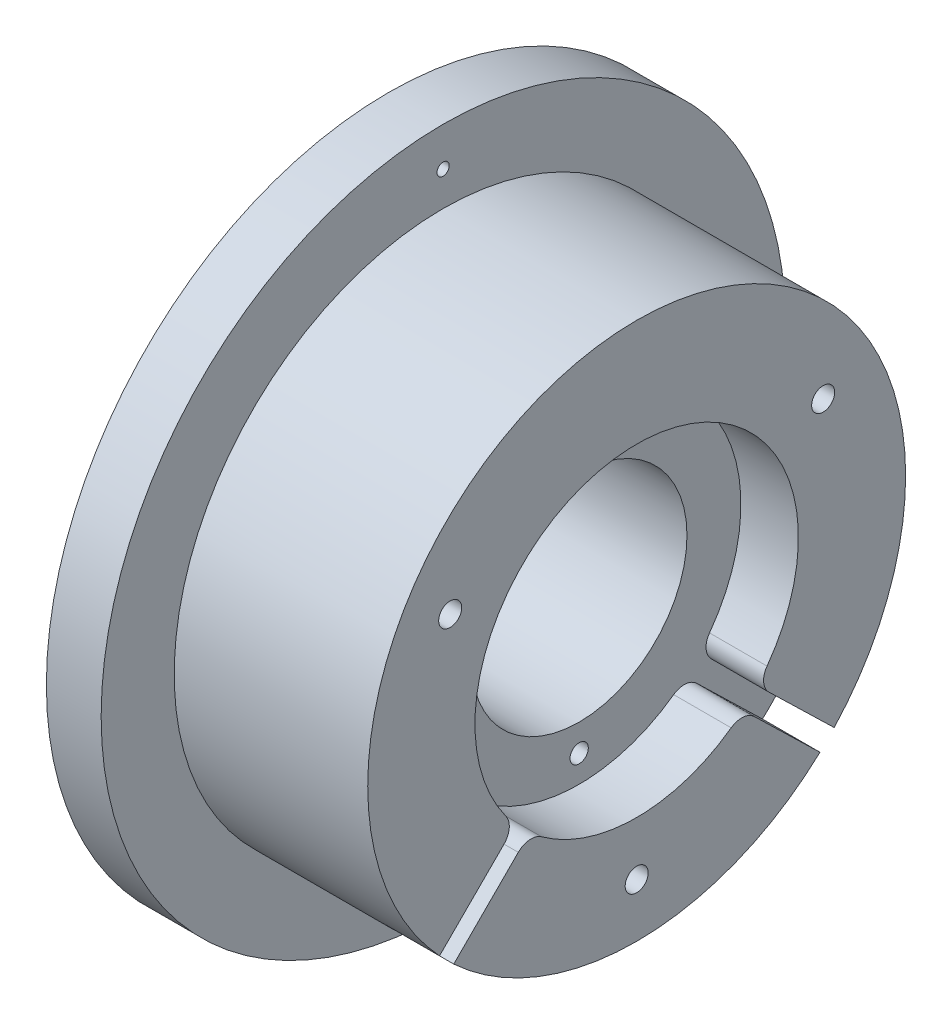
ISO-10303-21;
HEADER;
FILE_DESCRIPTION(('STEP AP214'),'2;1');
FILE_NAME('part.step','',(''),(''),'','','');
FILE_SCHEMA(('AUTOMOTIVE_DESIGN { 1 0 10303 214 1 1 1 1 }'));
ENDSEC;
DATA;
#1=APPLICATION_CONTEXT('core data for automotive mechanical design processes');
#2=APPLICATION_PROTOCOL_DEFINITION('international standard','automotive_design',2000,#1);
#3=PRODUCT_CONTEXT('',#1,'mechanical');
#4=PRODUCT('Part','Part','',(#3));
#5=PRODUCT_RELATED_PRODUCT_CATEGORY('part','',(#4));
#6=PRODUCT_DEFINITION_FORMATION('','',#4);
#7=PRODUCT_DEFINITION_CONTEXT('part definition',#1,'design');
#8=PRODUCT_DEFINITION('design','',#6,#7);
#9=PRODUCT_DEFINITION_SHAPE('','',#8);
#10=(LENGTH_UNIT() NAMED_UNIT(*) SI_UNIT(.MILLI.,.METRE.));
#11=(NAMED_UNIT(*) PLANE_ANGLE_UNIT() SI_UNIT($,.RADIAN.));
#12=(NAMED_UNIT(*) SI_UNIT($,.STERADIAN.) SOLID_ANGLE_UNIT());
#13=UNCERTAINTY_MEASURE_WITH_UNIT(LENGTH_MEASURE(1.E-05),#10,'distance_accuracy_value','');
#14=(GEOMETRIC_REPRESENTATION_CONTEXT(3) GLOBAL_UNCERTAINTY_ASSIGNED_CONTEXT((#13)) GLOBAL_UNIT_ASSIGNED_CONTEXT((#10,
#11,#12)) REPRESENTATION_CONTEXT('',''));
#15=CARTESIAN_POINT('',(0.,0.,0.));
#16=DIRECTION('',(0.,0.,1.));
#17=DIRECTION('',(1.,0.,0.));
#18=AXIS2_PLACEMENT_3D('',#15,#16,#17);
#19=CARTESIAN_POINT('',(17.272,0.,0.));
#20=DIRECTION('',(-1.,0.,0.));
#21=DIRECTION('',(0.,-1.,0.));
#22=AXIS2_PLACEMENT_3D('',#19,#20,#21);
#23=PLANE('',#22);
#24=CARTESIAN_POINT('',(17.272,7.48875,12.9708954851814));
#25=DIRECTION('',(1.,0.,0.));
#26=DIRECTION('',(0.,0.,-1.));
#27=AXIS2_PLACEMENT_3D('',#24,#25,#26);
#28=CIRCLE('',#27,0.79999999999999);
#29=CARTESIAN_POINT('',(17.272,7.48875,12.1708954851814));
#30=VERTEX_POINT('',#29);
#31=EDGE_CURVE('E183',#30,#30,#28,.T.);
#32=ORIENTED_EDGE('',*,*,#31,.F.);
#33=EDGE_LOOP('',(#32));
#34=FACE_BOUND('',#33,.T.);
#35=DIRECTION('',(0.,0.707106781186554,-0.707106781186541));
#36=VECTOR('',#35,1.);
#37=CARTESIAN_POINT('',(17.272,0.494974746830583,0.494974746830592));
#38=LINE('',#37,#36);
#39=CARTESIAN_POINT('',(17.272,-12.7236785584424,13.7136280521033));
#40=VERTEX_POINT('',#39);
#41=CARTESIAN_POINT('',(17.272,-8.2356466514435,9.22559614510452));
#42=VERTEX_POINT('',#41);
#43=EDGE_CURVE('E240',#40,#42,#38,.T.);
#44=ORIENTED_EDGE('',*,*,#43,.T.);
#45=CARTESIAN_POINT('',(17.272,-7.35176317496033,10.1094796215877));
#46=DIRECTION('',(-1.,0.,0.));
#47=DIRECTION('',(0.,-1.,0.));
#48=AXIS2_PLACEMENT_3D('',#45,#46,#47);
#49=CIRCLE('',#48,1.25);
#50=CARTESIAN_POINT('',(17.272,-6.6165868574643,9.09853165942894));
#51=VERTEX_POINT('',#50);
#52=EDGE_CURVE('E285',#42,#51,#49,.F.);
#53=ORIENTED_EDGE('',*,*,#52,.T.);
#54=CARTESIAN_POINT('',(17.272,0.,0.));
#55=DIRECTION('',(1.,0.,0.));
#56=DIRECTION('',(0.,1.,0.));
#57=AXIS2_PLACEMENT_3D('',#54,#55,#56);
#58=CIRCLE('',#57,11.25);
#59=CARTESIAN_POINT('',(17.272,-6.65957270857316,-9.06711593282161));
#60=VERTEX_POINT('',#59);
#61=EDGE_CURVE('E270',#60,#51,#58,.T.);
#62=ORIENTED_EDGE('',*,*,#61,.F.);
#63=CARTESIAN_POINT('',(17.272,-7.39952523174796,-10.0745732586907));
#64=DIRECTION('',(-1.,0.,0.));
#65=DIRECTION('',(0.,-1.,0.));
#66=AXIS2_PLACEMENT_3D('',#63,#64,#65);
#67=CIRCLE('',#66,1.25);
#68=CARTESIAN_POINT('',(17.272,-8.29660927780091,-9.20409051083334));
#69=VERTEX_POINT('',#68);
#70=EDGE_CURVE('E283',#60,#69,#67,.F.);
#71=ORIENTED_EDGE('',*,*,#70,.T.);
#72=DIRECTION('',(0.,-0.696386198285868,-0.717667236842365));
#73=VECTOR('',#72,1.);
#74=CARTESIAN_POINT('',(17.272,0.326823466436906,-0.317132146514021));
#75=LINE('',#74,#73);
#76=CARTESIAN_POINT('',(17.272,-12.6966821527148,-13.7386263040718));
#77=VERTEX_POINT('',#76);
#78=EDGE_CURVE('E218',#69,#77,#75,.T.);
#79=ORIENTED_EDGE('',*,*,#78,.T.);
#80=CARTESIAN_POINT('',(17.272,0.,0.));
#81=DIRECTION('',(1.,0.,0.));
#82=DIRECTION('',(0.,1.,0.));
#83=AXIS2_PLACEMENT_3D('',#80,#81,#82);
#84=CIRCLE('',#83,18.7071);
#85=EDGE_CURVE('E266',#77,#40,#84,.T.);
#86=ORIENTED_EDGE('',*,*,#85,.T.);
#87=EDGE_LOOP('',(#44,#53,#62,#71,#79,#86));
#88=FACE_BOUND('',#87,.T.);
#89=CARTESIAN_POINT('',(17.272,7.48875000000001,-12.9708954851814));
#90=DIRECTION('',(1.,0.,0.));
#91=DIRECTION('',(0.,0.,-1.));
#92=AXIS2_PLACEMENT_3D('',#89,#90,#91);
#93=CIRCLE('',#92,0.79999999999999);
#94=CARTESIAN_POINT('',(17.272,7.48875000000001,-13.7708954851814));
#95=VERTEX_POINT('',#94);
#96=EDGE_CURVE('E182',#95,#95,#93,.T.);
#97=ORIENTED_EDGE('',*,*,#96,.F.);
#98=EDGE_LOOP('',(#97));
#99=FACE_BOUND('',#98,.T.);
#100=ADVANCED_FACE('F77',(#34,#88,#99),#23,.F.);
#101=CARTESIAN_POINT('',(13.272,0.,0.));
#102=DIRECTION('',(1.,0.,0.));
#103=DIRECTION('',(0.,1.,0.));
#104=AXIS2_PLACEMENT_3D('',#101,#102,#103);
#105=CYLINDRICAL_SURFACE('',#104,11.25);
#106=ORIENTED_EDGE('',*,*,#61,.T.);
#107=DIRECTION('',(1.,0.,0.));
#108=VECTOR('',#107,1.);
#109=CARTESIAN_POINT('',(13.272,-6.61658685746429,9.09853165942894));
#110=LINE('',#109,#108);
#111=CARTESIAN_POINT('',(13.272,-6.61658685746429,9.09853165942894));
#112=VERTEX_POINT('',#111);
#113=EDGE_CURVE('E289',#51,#112,#110,.F.);
#114=ORIENTED_EDGE('',*,*,#113,.T.);
#115=CARTESIAN_POINT('',(13.272,0.,0.));
#116=DIRECTION('',(1.,0.,0.));
#117=DIRECTION('',(0.,1.,0.));
#118=AXIS2_PLACEMENT_3D('',#115,#116,#117);
#119=CIRCLE('',#118,11.25);
#120=CARTESIAN_POINT('',(13.272,-6.65957270857316,-9.06711593282161));
#121=VERTEX_POINT('',#120);
#122=EDGE_CURVE('E274',#121,#112,#119,.T.);
#123=ORIENTED_EDGE('',*,*,#122,.F.);
#124=DIRECTION('',(1.,0.,0.));
#125=VECTOR('',#124,1.);
#126=CARTESIAN_POINT('',(13.272,-6.65957270857316,-9.06711593282161));
#127=LINE('',#126,#125);
#128=EDGE_CURVE('E287',#121,#60,#127,.T.);
#129=ORIENTED_EDGE('',*,*,#128,.T.);
#130=EDGE_LOOP('',(#106,#114,#123,#129));
#131=FACE_BOUND('',#130,.T.);
#132=ADVANCED_FACE('F349',(#131),#105,.F.);
#133=CARTESIAN_POINT('',(13.272,-9.09853165942906,6.61658685746414));
#134=VERTEX_POINT('',#133);
#135=CARTESIAN_POINT('',(13.272,-9.13015115297179,-6.57288672684141));
#136=VERTEX_POINT('',#135);
#137=EDGE_CURVE('E275',#134,#136,#119,.T.);
#138=ORIENTED_EDGE('',*,*,#137,.F.);
#139=DIRECTION('',(1.,0.,0.));
#140=VECTOR('',#139,1.);
#141=CARTESIAN_POINT('',(13.272,-9.09853165942906,6.61658685746414));
#142=LINE('',#141,#140);
#143=CARTESIAN_POINT('',(17.272,-9.09853165942906,6.61658685746414));
#144=VERTEX_POINT('',#143);
#145=EDGE_CURVE('E296',#134,#144,#142,.T.);
#146=ORIENTED_EDGE('',*,*,#145,.T.);
#147=CARTESIAN_POINT('',(17.272,-9.13015115297179,-6.57288672684141));
#148=VERTEX_POINT('',#147);
#149=EDGE_CURVE('E271',#144,#148,#58,.T.);
#150=ORIENTED_EDGE('',*,*,#149,.T.);
#151=DIRECTION('',(1.,0.,0.));
#152=VECTOR('',#151,1.);
#153=CARTESIAN_POINT('',(13.272,-9.13015115297179,-6.57288672684141));
#154=LINE('',#153,#152);
#155=EDGE_CURVE('E294',#148,#136,#154,.F.);
#156=ORIENTED_EDGE('',*,*,#155,.T.);
#157=EDGE_LOOP('',(#138,#146,#150,#156));
#158=FACE_BOUND('',#157,.T.);
#159=ADVANCED_FACE('F317',(#158),#105,.F.);
#160=CARTESIAN_POINT('',(17.272,-14.9775,0.));
#161=DIRECTION('',(1.,0.,0.));
#162=DIRECTION('',(0.,0.,-1.));
#163=AXIS2_PLACEMENT_3D('',#160,#161,#162);
#164=CIRCLE('',#163,0.79999999999999);
#165=CARTESIAN_POINT('',(17.272,-14.9775,-0.799999999999992));
#166=VERTEX_POINT('',#165);
#167=EDGE_CURVE('E193',#166,#166,#164,.T.);
#168=ORIENTED_EDGE('',*,*,#167,.F.);
#169=EDGE_LOOP('',(#168));
#170=FACE_BOUND('',#169,.T.);
#171=ORIENTED_EDGE('',*,*,#149,.F.);
#172=CARTESIAN_POINT('',(17.272,-10.1094796215878,7.35176317496015));
#173=DIRECTION('',(-1.,0.,0.));
#174=DIRECTION('',(0.,-1.,0.));
#175=AXIS2_PLACEMENT_3D('',#172,#173,#174);
#176=CIRCLE('',#175,1.25);
#177=CARTESIAN_POINT('',(17.272,-9.22559614510466,8.23564665144334));
#178=VERTEX_POINT('',#177);
#179=EDGE_CURVE('E300',#144,#178,#176,.F.);
#180=ORIENTED_EDGE('',*,*,#179,.T.);
#181=DIRECTION('',(0.,-0.707106781186553,0.707106781186542));
#182=VECTOR('',#181,1.);
#183=CARTESIAN_POINT('',(17.272,-0.494974746830585,-0.494974746830593));
#184=LINE('',#183,#182);
#185=CARTESIAN_POINT('',(17.272,-13.7136280521035,12.7236785584421));
#186=VERTEX_POINT('',#185);
#187=EDGE_CURVE('E236',#178,#186,#184,.T.);
#188=ORIENTED_EDGE('',*,*,#187,.T.);
#189=CARTESIAN_POINT('',(17.272,-13.6886585047887,-12.7505379788179));
#190=VERTEX_POINT('',#189);
#191=EDGE_CURVE('E267',#186,#190,#84,.T.);
#192=ORIENTED_EDGE('',*,*,#191,.T.);
#193=DIRECTION('',(0.,0.696386198285868,0.717667236842366));
#194=VECTOR('',#193,1.);
#195=CARTESIAN_POINT('',(17.272,-0.677910665142419,0.657808531086206));
#196=LINE('',#195,#194);
#197=CARTESIAN_POINT('',(17.272,-9.24752834613792,-8.17369022212556));
#198=VERTEX_POINT('',#197);
#199=EDGE_CURVE('E222',#190,#198,#196,.T.);
#200=ORIENTED_EDGE('',*,*,#199,.T.);
#201=CARTESIAN_POINT('',(17.272,-10.1446123921909,-7.30320747426823));
#202=DIRECTION('',(-1.,0.,0.));
#203=DIRECTION('',(0.,-1.,0.));
#204=AXIS2_PLACEMENT_3D('',#201,#202,#203);
#205=CIRCLE('',#204,1.25);
#206=EDGE_CURVE('E298',#198,#148,#205,.F.);
#207=ORIENTED_EDGE('',*,*,#206,.T.);
#208=EDGE_LOOP('',(#171,#180,#188,#192,#200,#207));
#209=FACE_BOUND('',#208,.T.);
#210=ADVANCED_FACE('F324',(#170,#209),#23,.F.);
#211=CARTESIAN_POINT('',(13.272,0.,0.));
#212=DIRECTION('',(1.,0.,0.));
#213=DIRECTION('',(0.,1.,0.));
#214=AXIS2_PLACEMENT_3D('',#211,#212,#213);
#215=CYLINDRICAL_SURFACE('',#214,18.7071);
#216=CARTESIAN_POINT('',(3.81,0.,0.));
#217=DIRECTION('',(1.,0.,0.));
#218=DIRECTION('',(0.,1.,0.));
#219=AXIS2_PLACEMENT_3D('',#216,#217,#218);
#220=CIRCLE('',#219,18.7071);
#221=CARTESIAN_POINT('',(3.81,18.7071,0.));
#222=VERTEX_POINT('',#221);
#223=EDGE_CURVE('E263',#222,#222,#220,.T.);
#224=ORIENTED_EDGE('',*,*,#223,.T.);
#225=EDGE_LOOP('',(#224));
#226=FACE_BOUND('',#225,.T.);
#227=DIRECTION('',(1.,0.,0.));
#228=VECTOR('',#227,1.);
#229=CARTESIAN_POINT('',(-6.47510074540848,-12.6966821527148,-13.7386263040718));
#230=LINE('',#229,#228);
#231=CARTESIAN_POINT('',(13.272,-12.6966821527148,-13.7386263040718));
#232=VERTEX_POINT('',#231);
#233=EDGE_CURVE('E221',#232,#77,#230,.T.);
#234=ORIENTED_EDGE('',*,*,#233,.F.);
#235=CARTESIAN_POINT('',(13.272,0.,0.));
#236=DIRECTION('',(-1.,0.,0.));
#237=DIRECTION('',(0.,-1.,0.));
#238=AXIS2_PLACEMENT_3D('',#235,#236,#237);
#239=CIRCLE('',#238,18.7071);
#240=CARTESIAN_POINT('',(13.272,-13.6886585047887,-12.7505379788179));
#241=VERTEX_POINT('',#240);
#242=EDGE_CURVE('E226',#241,#232,#239,.F.);
#243=ORIENTED_EDGE('',*,*,#242,.F.);
#244=DIRECTION('',(1.,0.,0.));
#245=VECTOR('',#244,1.);
#246=CARTESIAN_POINT('',(-6.47510074540848,-13.6886585047887,-12.7505379788179));
#247=LINE('',#246,#245);
#248=EDGE_CURVE('E220',#241,#190,#247,.T.);
#249=ORIENTED_EDGE('',*,*,#248,.T.);
#250=ORIENTED_EDGE('',*,*,#191,.F.);
#251=DIRECTION('',(1.,0.,0.));
#252=VECTOR('',#251,1.);
#253=CARTESIAN_POINT('',(-6.47510074540848,-13.7136280521035,12.7236785584421));
#254=LINE('',#253,#252);
#255=CARTESIAN_POINT('',(13.272,-13.7136280521035,12.7236785584421));
#256=VERTEX_POINT('',#255);
#257=EDGE_CURVE('E239',#256,#186,#254,.T.);
#258=ORIENTED_EDGE('',*,*,#257,.F.);
#259=CARTESIAN_POINT('',(13.272,0.,0.));
#260=DIRECTION('',(-1.,0.,0.));
#261=DIRECTION('',(0.,-1.,0.));
#262=AXIS2_PLACEMENT_3D('',#259,#260,#261);
#263=CIRCLE('',#262,18.7071);
#264=CARTESIAN_POINT('',(13.272,-12.7236785584424,13.7136280521033));
#265=VERTEX_POINT('',#264);
#266=EDGE_CURVE('E243',#265,#256,#263,.F.);
#267=ORIENTED_EDGE('',*,*,#266,.F.);
#268=DIRECTION('',(1.,0.,0.));
#269=VECTOR('',#268,1.);
#270=CARTESIAN_POINT('',(-6.47510074540848,-12.7236785584424,13.7136280521033));
#271=LINE('',#270,#269);
#272=EDGE_CURVE('E244',#265,#40,#271,.T.);
#273=ORIENTED_EDGE('',*,*,#272,.T.);
#274=ORIENTED_EDGE('',*,*,#85,.F.);
#275=EDGE_LOOP('',(#234,#243,#249,#250,#258,#267,#273,#274));
#276=FACE_BOUND('',#275,.T.);
#277=ADVANCED_FACE('F332',(#226,#276),#215,.T.);
#278=CARTESIAN_POINT('',(13.272,0.,0.));
#279=DIRECTION('',(1.,0.,0.));
#280=DIRECTION('',(0.,1.,0.));
#281=AXIS2_PLACEMENT_3D('',#278,#279,#280);
#282=CYLINDRICAL_SURFACE('',#281,7.5);
#283=CARTESIAN_POINT('',(0.,0.,0.));
#284=DIRECTION('',(1.,0.,0.));
#285=DIRECTION('',(0.,1.,0.));
#286=AXIS2_PLACEMENT_3D('',#283,#284,#285);
#287=CIRCLE('',#286,7.5);
#288=CARTESIAN_POINT('',(0.,7.5,0.));
#289=VERTEX_POINT('',#288);
#290=EDGE_CURVE('E238',#289,#289,#287,.T.);
#291=ORIENTED_EDGE('',*,*,#290,.F.);
#292=EDGE_LOOP('',(#291));
#293=FACE_BOUND('',#292,.T.);
#294=CARTESIAN_POINT('',(13.272,0.,0.));
#295=DIRECTION('',(1.,0.,0.));
#296=DIRECTION('',(0.,1.,0.));
#297=AXIS2_PLACEMENT_3D('',#294,#295,#296);
#298=CIRCLE('',#297,7.5);
#299=CARTESIAN_POINT('',(13.272,7.5,0.));
#300=VERTEX_POINT('',#299);
#301=EDGE_CURVE('E277',#300,#300,#298,.T.);
#302=ORIENTED_EDGE('',*,*,#301,.T.);
#303=EDGE_LOOP('',(#302));
#304=FACE_BOUND('',#303,.T.);
#305=ADVANCED_FACE('F366',(#293,#304),#282,.F.);
#306=CARTESIAN_POINT('',(13.272,0.,0.));
#307=DIRECTION('',(-1.,0.,0.));
#308=DIRECTION('',(0.,-1.,0.));
#309=AXIS2_PLACEMENT_3D('',#306,#307,#308);
#310=PLANE('',#309);
#311=CARTESIAN_POINT('',(13.272,9.375,0.));
#312=DIRECTION('',(1.,0.,0.));
#313=DIRECTION('',(0.,1.,0.));
#314=AXIS2_PLACEMENT_3D('',#311,#312,#313);
#315=CIRCLE('',#314,0.635);
#316=CARTESIAN_POINT('',(13.272,10.01,0.));
#317=VERTEX_POINT('',#316);
#318=EDGE_CURVE('E204',#317,#317,#315,.T.);
#319=ORIENTED_EDGE('',*,*,#318,.F.);
#320=EDGE_LOOP('',(#319));
#321=FACE_BOUND('',#320,.T.);
#322=CARTESIAN_POINT('',(13.272,-9.375,0.));
#323=DIRECTION('',(1.,0.,0.));
#324=DIRECTION('',(0.,1.,0.));
#325=AXIS2_PLACEMENT_3D('',#322,#323,#324);
#326=CIRCLE('',#325,0.635);
#327=CARTESIAN_POINT('',(13.272,-8.74,0.));
#328=VERTEX_POINT('',#327);
#329=EDGE_CURVE('E199',#328,#328,#326,.T.);
#330=ORIENTED_EDGE('',*,*,#329,.F.);
#331=EDGE_LOOP('',(#330));
#332=FACE_BOUND('',#331,.T.);
#333=ORIENTED_EDGE('',*,*,#301,.F.);
#334=EDGE_LOOP('',(#333));
#335=FACE_BOUND('',#334,.T.);
#336=DIRECTION('',(0.,-0.707106781186553,0.707106781186542));
#337=VECTOR('',#336,1.);
#338=CARTESIAN_POINT('',(13.272,-0.494974746830585,-0.494974746830594));
#339=LINE('',#338,#337);
#340=CARTESIAN_POINT('',(13.272,-9.22559614510467,8.23564665144334));
#341=VERTEX_POINT('',#340);
#342=EDGE_CURVE('E225',#341,#256,#339,.T.);
#343=ORIENTED_EDGE('',*,*,#342,.F.);
#344=CARTESIAN_POINT('',(13.272,-10.1094796215878,7.35176317496015));
#345=DIRECTION('',(-1.,0.,0.));
#346=DIRECTION('',(0.,-1.,0.));
#347=AXIS2_PLACEMENT_3D('',#344,#345,#346);
#348=CIRCLE('',#347,1.25);
#349=EDGE_CURVE('E309',#341,#134,#348,.T.);
#350=ORIENTED_EDGE('',*,*,#349,.T.);
#351=ORIENTED_EDGE('',*,*,#137,.T.);
#352=CARTESIAN_POINT('',(13.272,-10.1446123921909,-7.30320747426823));
#353=DIRECTION('',(-1.,0.,0.));
#354=DIRECTION('',(0.,-1.,0.));
#355=AXIS2_PLACEMENT_3D('',#352,#353,#354);
#356=CIRCLE('',#355,1.25);
#357=CARTESIAN_POINT('',(13.272,-9.24752834613792,-8.17369022212556));
#358=VERTEX_POINT('',#357);
#359=EDGE_CURVE('E85',#136,#358,#356,.T.);
#360=ORIENTED_EDGE('',*,*,#359,.T.);
#361=DIRECTION('',(0.,0.696386198285868,0.717667236842366));
#362=VECTOR('',#361,1.);
#363=CARTESIAN_POINT('',(13.272,-0.677910665142419,0.657808531086206));
#364=LINE('',#363,#362);
#365=EDGE_CURVE('E215',#241,#358,#364,.T.);
#366=ORIENTED_EDGE('',*,*,#365,.F.);
#367=ORIENTED_EDGE('',*,*,#242,.T.);
#368=DIRECTION('',(0.,-0.696386198285868,-0.717667236842365));
#369=VECTOR('',#368,1.);
#370=CARTESIAN_POINT('',(13.272,0.326823466436906,-0.317132146514021));
#371=LINE('',#370,#369);
#372=CARTESIAN_POINT('',(13.272,-8.29660927780091,-9.20409051083334));
#373=VERTEX_POINT('',#372);
#374=EDGE_CURVE('E229',#373,#232,#371,.T.);
#375=ORIENTED_EDGE('',*,*,#374,.F.);
#376=CARTESIAN_POINT('',(13.272,-7.39952523174796,-10.0745732586907));
#377=DIRECTION('',(-1.,0.,0.));
#378=DIRECTION('',(0.,-1.,0.));
#379=AXIS2_PLACEMENT_3D('',#376,#377,#378);
#380=CIRCLE('',#379,1.25);
#381=EDGE_CURVE('E12',#373,#121,#380,.T.);
#382=ORIENTED_EDGE('',*,*,#381,.T.);
#383=ORIENTED_EDGE('',*,*,#122,.T.);
#384=CARTESIAN_POINT('',(13.272,-7.35176317496033,10.1094796215877));
#385=DIRECTION('',(-1.,0.,0.));
#386=DIRECTION('',(0.,-1.,0.));
#387=AXIS2_PLACEMENT_3D('',#384,#385,#386);
#388=CIRCLE('',#387,1.25);
#389=CARTESIAN_POINT('',(13.272,-8.2356466514435,9.22559614510452));
#390=VERTEX_POINT('',#389);
#391=EDGE_CURVE('E307',#112,#390,#388,.T.);
#392=ORIENTED_EDGE('',*,*,#391,.T.);
#393=DIRECTION('',(0.,0.707106781186554,-0.707106781186541));
#394=VECTOR('',#393,1.);
#395=CARTESIAN_POINT('',(13.272,0.494974746830583,0.494974746830592));
#396=LINE('',#395,#394);
#397=EDGE_CURVE('E246',#265,#390,#396,.T.);
#398=ORIENTED_EDGE('',*,*,#397,.F.);
#399=ORIENTED_EDGE('',*,*,#266,.T.);
#400=EDGE_LOOP('',(#343,#350,#351,#360,#366,#367,#375,#382,#383,#392,#398,#399));
#401=FACE_BOUND('',#400,.T.);
#402=ADVANCED_FACE('F312',(#321,#332,#335,#401),#310,.F.);
#403=CARTESIAN_POINT('',(3.81,0.,0.));
#404=DIRECTION('',(-1.,0.,0.));
#405=DIRECTION('',(0.,-1.,0.));
#406=AXIS2_PLACEMENT_3D('',#403,#404,#405);
#407=PLANE('',#406);
#408=CARTESIAN_POINT('',(3.81,21.082,0.));
#409=DIRECTION('',(1.,0.,0.));
#410=DIRECTION('',(0.,1.,0.));
#411=AXIS2_PLACEMENT_3D('',#408,#409,#410);
#412=CIRCLE('',#411,0.425000000000001);
#413=CARTESIAN_POINT('',(3.81,21.507,0.));
#414=VERTEX_POINT('',#413);
#415=EDGE_CURVE('E203',#414,#414,#412,.T.);
#416=ORIENTED_EDGE('',*,*,#415,.F.);
#417=EDGE_LOOP('',(#416));
#418=FACE_BOUND('',#417,.T.);
#419=ORIENTED_EDGE('',*,*,#223,.F.);
#420=EDGE_LOOP('',(#419));
#421=FACE_BOUND('',#420,.T.);
#422=CARTESIAN_POINT('',(3.81,0.,0.));
#423=DIRECTION('',(1.,0.,0.));
#424=DIRECTION('',(0.,1.,0.));
#425=AXIS2_PLACEMENT_3D('',#422,#423,#424);
#426=CIRCLE('',#425,23.7871);
#427=CARTESIAN_POINT('',(3.81,23.7871,0.));
#428=VERTEX_POINT('',#427);
#429=EDGE_CURVE('E260',#428,#428,#426,.T.);
#430=ORIENTED_EDGE('',*,*,#429,.T.);
#431=EDGE_LOOP('',(#430));
#432=FACE_BOUND('',#431,.T.);
#433=ADVANCED_FACE('F417',(#418,#421,#432),#407,.F.);
#434=CARTESIAN_POINT('',(13.272,0.,0.));
#435=DIRECTION('',(1.,0.,0.));
#436=DIRECTION('',(0.,1.,0.));
#437=AXIS2_PLACEMENT_3D('',#434,#435,#436);
#438=CYLINDRICAL_SURFACE('',#437,23.7871);
#439=ORIENTED_EDGE('',*,*,#429,.F.);
#440=EDGE_LOOP('',(#439));
#441=FACE_BOUND('',#440,.T.);
#442=CARTESIAN_POINT('',(0.,0.,0.));
#443=DIRECTION('',(1.,0.,0.));
#444=DIRECTION('',(0.,1.,0.));
#445=AXIS2_PLACEMENT_3D('',#442,#443,#444);
#446=CIRCLE('',#445,23.7871);
#447=CARTESIAN_POINT('',(0.,23.7871,0.));
#448=VERTEX_POINT('',#447);
#449=EDGE_CURVE('E257',#448,#448,#446,.T.);
#450=ORIENTED_EDGE('',*,*,#449,.T.);
#451=EDGE_LOOP('',(#450));
#452=FACE_BOUND('',#451,.T.);
#453=ADVANCED_FACE('F413',(#441,#452),#438,.T.);
#454=CARTESIAN_POINT('',(0.,0.,0.));
#455=DIRECTION('',(1.,0.,0.));
#456=DIRECTION('',(0.,1.,0.));
#457=AXIS2_PLACEMENT_3D('',#454,#455,#456);
#458=PLANE('',#457);
#459=CARTESIAN_POINT('',(0.,9.375,0.));
#460=DIRECTION('',(1.,0.,0.));
#461=DIRECTION('',(0.,1.,0.));
#462=AXIS2_PLACEMENT_3D('',#459,#460,#461);
#463=CIRCLE('',#462,0.635);
#464=CARTESIAN_POINT('',(0.,10.01,0.));
#465=VERTEX_POINT('',#464);
#466=EDGE_CURVE('E200',#465,#465,#463,.T.);
#467=ORIENTED_EDGE('',*,*,#466,.T.);
#468=EDGE_LOOP('',(#467));
#469=FACE_BOUND('',#468,.T.);
#470=CARTESIAN_POINT('',(0.,-9.375,0.));
#471=DIRECTION('',(1.,0.,0.));
#472=DIRECTION('',(0.,1.,0.));
#473=AXIS2_PLACEMENT_3D('',#470,#471,#472);
#474=CIRCLE('',#473,0.635);
#475=CARTESIAN_POINT('',(0.,-8.74,0.));
#476=VERTEX_POINT('',#475);
#477=EDGE_CURVE('E207',#476,#476,#474,.T.);
#478=ORIENTED_EDGE('',*,*,#477,.T.);
#479=EDGE_LOOP('',(#478));
#480=FACE_BOUND('',#479,.T.);
#481=CARTESIAN_POINT('',(0.,21.082,0.));
#482=DIRECTION('',(1.,0.,0.));
#483=DIRECTION('',(0.,1.,0.));
#484=AXIS2_PLACEMENT_3D('',#481,#482,#483);
#485=CIRCLE('',#484,0.425000000000001);
#486=CARTESIAN_POINT('',(0.,21.507,0.));
#487=VERTEX_POINT('',#486);
#488=EDGE_CURVE('E212',#487,#487,#485,.T.);
#489=ORIENTED_EDGE('',*,*,#488,.T.);
#490=EDGE_LOOP('',(#489));
#491=FACE_BOUND('',#490,.T.);
#492=ORIENTED_EDGE('',*,*,#449,.F.);
#493=EDGE_LOOP('',(#492));
#494=FACE_BOUND('',#493,.T.);
#495=ORIENTED_EDGE('',*,*,#290,.T.);
#496=EDGE_LOOP('',(#495));
#497=FACE_BOUND('',#496,.T.);
#498=ADVANCED_FACE('F409',(#469,#480,#491,#494,#497),#458,.F.);
#499=CARTESIAN_POINT('',(-6.47510074540848,0.494974746830584,0.494974746830592));
#500=DIRECTION('',(0.,-0.707106781186541,-0.707106781186554));
#501=DIRECTION('',(0.,0.707106781186554,-0.707106781186541));
#502=AXIS2_PLACEMENT_3D('',#499,#500,#501);
#503=PLANE('',#502);
#504=ORIENTED_EDGE('',*,*,#397,.T.);
#505=DIRECTION('',(-1.,0.,0.));
#506=VECTOR('',#505,1.);
#507=CARTESIAN_POINT('',(17.272,-8.2356466514435,9.22559614510452));
#508=LINE('',#507,#506);
#509=EDGE_CURVE('E280',#390,#42,#508,.F.);
#510=ORIENTED_EDGE('',*,*,#509,.T.);
#511=ORIENTED_EDGE('',*,*,#43,.F.);
#512=ORIENTED_EDGE('',*,*,#272,.F.);
#513=EDGE_LOOP('',(#504,#510,#511,#512));
#514=FACE_BOUND('',#513,.T.);
#515=ADVANCED_FACE('F406',(#514),#503,.T.);
#516=CARTESIAN_POINT('',(-6.47510074540848,-0.494974746830585,-0.494974746830593));
#517=DIRECTION('',(0.,0.707106781186542,0.707106781186553));
#518=DIRECTION('',(0.,-0.707106781186553,0.707106781186542));
#519=AXIS2_PLACEMENT_3D('',#516,#517,#518);
#520=PLANE('',#519);
#521=ORIENTED_EDGE('',*,*,#187,.F.);
#522=DIRECTION('',(-1.,0.,0.));
#523=VECTOR('',#522,1.);
#524=CARTESIAN_POINT('',(13.272,-9.22559614510466,8.23564665144334));
#525=LINE('',#524,#523);
#526=EDGE_CURVE('E291',#178,#341,#525,.T.);
#527=ORIENTED_EDGE('',*,*,#526,.T.);
#528=ORIENTED_EDGE('',*,*,#342,.T.);
#529=ORIENTED_EDGE('',*,*,#257,.T.);
#530=EDGE_LOOP('',(#521,#527,#528,#529));
#531=FACE_BOUND('',#530,.T.);
#532=ADVANCED_FACE('F326',(#531),#520,.T.);
#533=CARTESIAN_POINT('',(-6.47510074540848,0.326823466436906,-0.317132146514021));
#534=DIRECTION('',(0.,-0.717667236842365,0.696386198285868));
#535=DIRECTION('',(0.,-0.696386198285868,-0.717667236842365));
#536=AXIS2_PLACEMENT_3D('',#533,#534,#535);
#537=PLANE('',#536);
#538=ORIENTED_EDGE('',*,*,#78,.F.);
#539=DIRECTION('',(-1.,0.,0.));
#540=VECTOR('',#539,1.);
#541=CARTESIAN_POINT('',(13.272,-8.29660927780091,-9.20409051083334));
#542=LINE('',#541,#540);
#543=EDGE_CURVE('E305',#69,#373,#542,.T.);
#544=ORIENTED_EDGE('',*,*,#543,.T.);
#545=ORIENTED_EDGE('',*,*,#374,.T.);
#546=ORIENTED_EDGE('',*,*,#233,.T.);
#547=EDGE_LOOP('',(#538,#544,#545,#546));
#548=FACE_BOUND('',#547,.T.);
#549=ADVANCED_FACE('F400',(#548),#537,.T.);
#550=CARTESIAN_POINT('',(-6.47510074540848,-0.677910665142419,0.657808531086206));
#551=DIRECTION('',(0.,0.717667236842366,-0.696386198285867));
#552=DIRECTION('',(0.,0.696386198285868,0.717667236842366));
#553=AXIS2_PLACEMENT_3D('',#550,#551,#552);
#554=PLANE('',#553);
#555=ORIENTED_EDGE('',*,*,#365,.T.);
#556=DIRECTION('',(-1.,0.,0.));
#557=VECTOR('',#556,1.);
#558=CARTESIAN_POINT('',(17.272,-9.24752834613792,-8.17369022212556));
#559=LINE('',#558,#557);
#560=EDGE_CURVE('E302',#358,#198,#559,.F.);
#561=ORIENTED_EDGE('',*,*,#560,.T.);
#562=ORIENTED_EDGE('',*,*,#199,.F.);
#563=ORIENTED_EDGE('',*,*,#248,.F.);
#564=EDGE_LOOP('',(#555,#561,#562,#563));
#565=FACE_BOUND('',#564,.T.);
#566=ADVANCED_FACE('F336',(#565),#554,.T.);
#567=CARTESIAN_POINT('',(0.,21.082,0.));
#568=DIRECTION('',(1.,0.,0.));
#569=DIRECTION('',(0.,1.,0.));
#570=AXIS2_PLACEMENT_3D('',#567,#568,#569);
#571=CYLINDRICAL_SURFACE('',#570,0.425000000000001);
#572=ORIENTED_EDGE('',*,*,#488,.F.);
#573=EDGE_LOOP('',(#572));
#574=FACE_BOUND('',#573,.T.);
#575=ORIENTED_EDGE('',*,*,#415,.T.);
#576=EDGE_LOOP('',(#575));
#577=FACE_BOUND('',#576,.T.);
#578=ADVANCED_FACE('F393',(#574,#577),#571,.F.);
#579=CARTESIAN_POINT('',(0.,-9.375,0.));
#580=DIRECTION('',(1.,0.,0.));
#581=DIRECTION('',(0.,1.,0.));
#582=AXIS2_PLACEMENT_3D('',#579,#580,#581);
#583=CYLINDRICAL_SURFACE('',#582,0.635);
#584=ORIENTED_EDGE('',*,*,#477,.F.);
#585=EDGE_LOOP('',(#584));
#586=FACE_BOUND('',#585,.T.);
#587=ORIENTED_EDGE('',*,*,#329,.T.);
#588=EDGE_LOOP('',(#587));
#589=FACE_BOUND('',#588,.T.);
#590=ADVANCED_FACE('F389',(#586,#589),#583,.F.);
#591=CARTESIAN_POINT('',(0.,9.375,0.));
#592=DIRECTION('',(1.,0.,0.));
#593=DIRECTION('',(0.,1.,0.));
#594=AXIS2_PLACEMENT_3D('',#591,#592,#593);
#595=CYLINDRICAL_SURFACE('',#594,0.635);
#596=ORIENTED_EDGE('',*,*,#466,.F.);
#597=EDGE_LOOP('',(#596));
#598=FACE_BOUND('',#597,.T.);
#599=ORIENTED_EDGE('',*,*,#318,.T.);
#600=EDGE_LOOP('',(#599));
#601=FACE_BOUND('',#600,.T.);
#602=ADVANCED_FACE('F386',(#598,#601),#595,.F.);
#603=CARTESIAN_POINT('',(13.272,-7.35176317496033,10.1094796215877));
#604=DIRECTION('',(1.,0.,0.));
#605=DIRECTION('',(0.,1.,0.));
#606=AXIS2_PLACEMENT_3D('',#603,#604,#605);
#607=CYLINDRICAL_SURFACE('',#606,1.25);
#608=ORIENTED_EDGE('',*,*,#391,.F.);
#609=ORIENTED_EDGE('',*,*,#113,.F.);
#610=ORIENTED_EDGE('',*,*,#52,.F.);
#611=ORIENTED_EDGE('',*,*,#509,.F.);
#612=EDGE_LOOP('',(#608,#609,#610,#611));
#613=FACE_BOUND('',#612,.T.);
#614=ADVANCED_FACE('F346',(#613),#607,.T.);
#615=CARTESIAN_POINT('',(13.272,-10.1094796215878,7.35176317496015));
#616=DIRECTION('',(1.,0.,0.));
#617=DIRECTION('',(0.,1.,0.));
#618=AXIS2_PLACEMENT_3D('',#615,#616,#617);
#619=CYLINDRICAL_SURFACE('',#618,1.25);
#620=ORIENTED_EDGE('',*,*,#179,.F.);
#621=ORIENTED_EDGE('',*,*,#145,.F.);
#622=ORIENTED_EDGE('',*,*,#349,.F.);
#623=ORIENTED_EDGE('',*,*,#526,.F.);
#624=EDGE_LOOP('',(#620,#621,#622,#623));
#625=FACE_BOUND('',#624,.T.);
#626=ADVANCED_FACE('F321',(#625),#619,.T.);
#627=CARTESIAN_POINT('',(13.272,-10.1446123921909,-7.30320747426823));
#628=DIRECTION('',(1.,0.,0.));
#629=DIRECTION('',(0.,1.,0.));
#630=AXIS2_PLACEMENT_3D('',#627,#628,#629);
#631=CYLINDRICAL_SURFACE('',#630,1.25);
#632=ORIENTED_EDGE('',*,*,#359,.F.);
#633=ORIENTED_EDGE('',*,*,#155,.F.);
#634=ORIENTED_EDGE('',*,*,#206,.F.);
#635=ORIENTED_EDGE('',*,*,#560,.F.);
#636=EDGE_LOOP('',(#632,#633,#634,#635));
#637=FACE_BOUND('',#636,.T.);
#638=ADVANCED_FACE('F339',(#637),#631,.T.);
#639=CARTESIAN_POINT('',(13.272,-7.39952523174796,-10.0745732586907));
#640=DIRECTION('',(1.,0.,0.));
#641=DIRECTION('',(0.,1.,0.));
#642=AXIS2_PLACEMENT_3D('',#639,#640,#641);
#643=CYLINDRICAL_SURFACE('',#642,1.25);
#644=ORIENTED_EDGE('',*,*,#70,.F.);
#645=ORIENTED_EDGE('',*,*,#128,.F.);
#646=ORIENTED_EDGE('',*,*,#381,.F.);
#647=ORIENTED_EDGE('',*,*,#543,.F.);
#648=EDGE_LOOP('',(#644,#645,#646,#647));
#649=FACE_BOUND('',#648,.T.);
#650=ADVANCED_FACE('F79',(#649),#643,.T.);
#651=CARTESIAN_POINT('',(10.922,-14.9775,0.));
#652=DIRECTION('',(1.,0.,0.));
#653=DIRECTION('',(0.,0.,-1.));
#654=AXIS2_PLACEMENT_3D('',#651,#652,#653);
#655=CONICAL_SURFACE('',#654,0.799999999999997,1.02974425867665);
#656=CARTESIAN_POINT('',(10.441311504778,-14.9775,0.));
#657=VERTEX_POINT('',#656);
#658=VERTEX_LOOP('',#657);
#659=FACE_BOUND('',#658,.T.);
#660=CARTESIAN_POINT('',(10.922,-14.9775,0.));
#661=DIRECTION('',(1.,0.,0.));
#662=DIRECTION('',(0.,0.,-1.));
#663=AXIS2_PLACEMENT_3D('',#660,#661,#662);
#664=CIRCLE('',#663,0.799999999999997);
#665=CARTESIAN_POINT('',(10.922,-14.9775,-0.799999999999999));
#666=VERTEX_POINT('',#665);
#667=EDGE_CURVE('E196',#666,#666,#664,.T.);
#668=ORIENTED_EDGE('',*,*,#667,.T.);
#669=EDGE_LOOP('',(#668));
#670=FACE_BOUND('',#669,.T.);
#671=ADVANCED_FACE('F345',(#659,#670),#655,.F.);
#672=CARTESIAN_POINT('',(17.272,-14.9775,0.));
#673=DIRECTION('',(1.,0.,0.));
#674=DIRECTION('',(0.,0.,-1.));
#675=AXIS2_PLACEMENT_3D('',#672,#673,#674);
#676=CYLINDRICAL_SURFACE('',#675,0.799999999999993);
#677=ORIENTED_EDGE('',*,*,#667,.F.);
#678=EDGE_LOOP('',(#677));
#679=FACE_BOUND('',#678,.T.);
#680=ORIENTED_EDGE('',*,*,#167,.T.);
#681=EDGE_LOOP('',(#680));
#682=FACE_BOUND('',#681,.T.);
#683=ADVANCED_FACE('F370',(#679,#682),#676,.F.);
#684=CARTESIAN_POINT('',(10.922,7.48875000000001,-12.9708954851814));
#685=DIRECTION('',(1.,0.,0.));
#686=DIRECTION('',(0.,0.,-1.));
#687=AXIS2_PLACEMENT_3D('',#684,#685,#686);
#688=CONICAL_SURFACE('',#687,0.799999999999997,1.02974425867665);
#689=CARTESIAN_POINT('',(10.441311504778,7.48875000000001,-12.9708954851814));
#690=VERTEX_POINT('',#689);
#691=VERTEX_LOOP('',#690);
#692=FACE_BOUND('',#691,.T.);
#693=CARTESIAN_POINT('',(10.922,7.48875000000001,-12.9708954851814));
#694=DIRECTION('',(1.,0.,0.));
#695=DIRECTION('',(0.,0.,-1.));
#696=AXIS2_PLACEMENT_3D('',#693,#694,#695);
#697=CIRCLE('',#696,0.799999999999997);
#698=CARTESIAN_POINT('',(10.922,7.48875000000001,-13.7708954851814));
#699=VERTEX_POINT('',#698);
#700=EDGE_CURVE('E186',#699,#699,#697,.T.);
#701=ORIENTED_EDGE('',*,*,#700,.T.);
#702=EDGE_LOOP('',(#701));
#703=FACE_BOUND('',#702,.T.);
#704=ADVANCED_FACE('F372',(#692,#703),#688,.F.);
#705=CARTESIAN_POINT('',(17.272,7.48875000000001,-12.9708954851814));
#706=DIRECTION('',(1.,0.,0.));
#707=DIRECTION('',(0.,0.,-1.));
#708=AXIS2_PLACEMENT_3D('',#705,#706,#707);
#709=CYLINDRICAL_SURFACE('',#708,0.799999999999993);
#710=ORIENTED_EDGE('',*,*,#700,.F.);
#711=EDGE_LOOP('',(#710));
#712=FACE_BOUND('',#711,.T.);
#713=ORIENTED_EDGE('',*,*,#96,.T.);
#714=EDGE_LOOP('',(#713));
#715=FACE_BOUND('',#714,.T.);
#716=ADVANCED_FACE('F176',(#712,#715),#709,.F.);
#717=CARTESIAN_POINT('',(10.922,7.48875,12.9708954851814));
#718=DIRECTION('',(1.,0.,0.));
#719=DIRECTION('',(0.,0.,-1.));
#720=AXIS2_PLACEMENT_3D('',#717,#718,#719);
#721=CONICAL_SURFACE('',#720,0.799999999999997,1.02974425867665);
#722=CARTESIAN_POINT('',(10.441311504778,7.48874999999999,12.9708954851814));
#723=VERTEX_POINT('',#722);
#724=VERTEX_LOOP('',#723);
#725=FACE_BOUND('',#724,.T.);
#726=CARTESIAN_POINT('',(10.922,7.48875,12.9708954851814));
#727=DIRECTION('',(1.,0.,0.));
#728=DIRECTION('',(0.,0.,-1.));
#729=AXIS2_PLACEMENT_3D('',#726,#727,#728);
#730=CIRCLE('',#729,0.799999999999997);
#731=CARTESIAN_POINT('',(10.922,7.48875,12.1708954851814));
#732=VERTEX_POINT('',#731);
#733=EDGE_CURVE('E180',#732,#732,#730,.T.);
#734=ORIENTED_EDGE('',*,*,#733,.T.);
#735=EDGE_LOOP('',(#734));
#736=FACE_BOUND('',#735,.T.);
#737=ADVANCED_FACE('F172',(#725,#736),#721,.F.);
#738=CARTESIAN_POINT('',(17.272,7.48875,12.9708954851814));
#739=DIRECTION('',(1.,0.,0.));
#740=DIRECTION('',(0.,0.,-1.));
#741=AXIS2_PLACEMENT_3D('',#738,#739,#740);
#742=CYLINDRICAL_SURFACE('',#741,0.799999999999993);
#743=ORIENTED_EDGE('',*,*,#733,.F.);
#744=EDGE_LOOP('',(#743));
#745=FACE_BOUND('',#744,.T.);
#746=ORIENTED_EDGE('',*,*,#31,.T.);
#747=EDGE_LOOP('',(#746));
#748=FACE_BOUND('',#747,.T.);
#749=ADVANCED_FACE('F175',(#745,#748),#742,.F.);
#750=CLOSED_SHELL('',(#100,#132,#159,#210,#277,#305,#402,#433,#453,#498,#515,#532,#549,#566,
#578,#590,#602,#614,#626,#638,#650,#671,#683,#704,#716,#737,#749));
#751=MANIFOLD_SOLID_BREP('B2',#750);
#752=ADVANCED_BREP_SHAPE_REPRESENTATION('',(#18,#751),#14);
#753=SHAPE_DEFINITION_REPRESENTATION(#9,#752);
ENDSEC;
END-ISO-10303-21;
